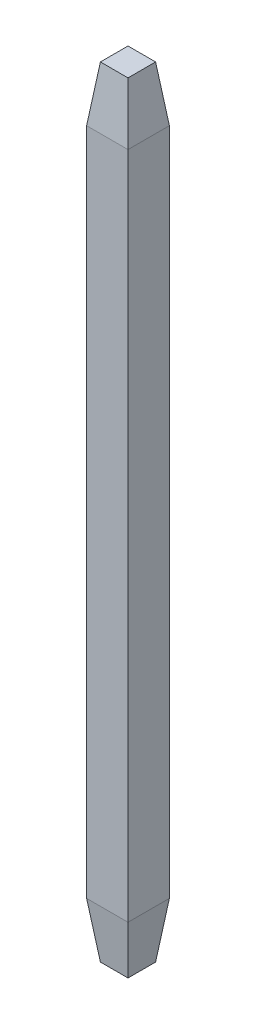
ISO-10303-21;
HEADER;
FILE_DESCRIPTION(('STEP AP214'),'2;1');
FILE_NAME('part.step','',(''),(''),'','','');
FILE_SCHEMA(('AUTOMOTIVE_DESIGN { 1 0 10303 214 1 1 1 1 }'));
ENDSEC;
DATA;
#1=APPLICATION_CONTEXT('core data for automotive mechanical design processes');
#2=APPLICATION_PROTOCOL_DEFINITION('international standard','automotive_design',2000,#1);
#3=PRODUCT_CONTEXT('',#1,'mechanical');
#4=PRODUCT('Part','Part','',(#3));
#5=PRODUCT_RELATED_PRODUCT_CATEGORY('part','',(#4));
#6=PRODUCT_DEFINITION_FORMATION('','',#4);
#7=PRODUCT_DEFINITION_CONTEXT('part definition',#1,'design');
#8=PRODUCT_DEFINITION('design','',#6,#7);
#9=PRODUCT_DEFINITION_SHAPE('','',#8);
#10=(LENGTH_UNIT() NAMED_UNIT(*) SI_UNIT(.MILLI.,.METRE.));
#11=(NAMED_UNIT(*) PLANE_ANGLE_UNIT() SI_UNIT($,.RADIAN.));
#12=(NAMED_UNIT(*) SI_UNIT($,.STERADIAN.) SOLID_ANGLE_UNIT());
#13=UNCERTAINTY_MEASURE_WITH_UNIT(LENGTH_MEASURE(1.E-05),#10,'distance_accuracy_value','');
#14=(GEOMETRIC_REPRESENTATION_CONTEXT(3) GLOBAL_UNCERTAINTY_ASSIGNED_CONTEXT((#13)) GLOBAL_UNIT_ASSIGNED_CONTEXT((#10,
#11,#12)) REPRESENTATION_CONTEXT('',''));
#15=CARTESIAN_POINT('',(0.,0.,0.));
#16=DIRECTION('',(0.,0.,1.));
#17=DIRECTION('',(1.,0.,0.));
#18=AXIS2_PLACEMENT_3D('',#15,#16,#17);
#19=CARTESIAN_POINT('',(0.3,11.3,0.3));
#20=DIRECTION('',(-1.,0.,0.));
#21=DIRECTION('',(0.,0.,1.));
#22=AXIS2_PLACEMENT_3D('',#19,#20,#21);
#23=PLANE('',#22);
#24=DIRECTION('',(0.,-1.,0.));
#25=VECTOR('',#24,1.);
#26=CARTESIAN_POINT('',(0.3,11.3,0.3));
#27=LINE('',#26,#25);
#28=CARTESIAN_POINT('',(0.3,10.5,0.3));
#29=VERTEX_POINT('',#28);
#30=CARTESIAN_POINT('',(0.3,0.8,0.3));
#31=VERTEX_POINT('',#30);
#32=EDGE_CURVE('E141',#29,#31,#27,.T.);
#33=ORIENTED_EDGE('',*,*,#32,.T.);
#34=DIRECTION('',(0.,0.,-1.));
#35=VECTOR('',#34,1.);
#36=CARTESIAN_POINT('',(0.3,0.8,-0.3));
#37=LINE('',#36,#35);
#38=CARTESIAN_POINT('',(0.3,0.8,-0.3));
#39=VERTEX_POINT('',#38);
#40=EDGE_CURVE('E150',#31,#39,#37,.T.);
#41=ORIENTED_EDGE('',*,*,#40,.T.);
#42=DIRECTION('',(0.,-1.,0.));
#43=VECTOR('',#42,1.);
#44=CARTESIAN_POINT('',(0.3,11.3,-0.3));
#45=LINE('',#44,#43);
#46=CARTESIAN_POINT('',(0.3,10.5,-0.3));
#47=VERTEX_POINT('',#46);
#48=EDGE_CURVE('E119',#47,#39,#45,.T.);
#49=ORIENTED_EDGE('',*,*,#48,.F.);
#50=DIRECTION('',(0.,0.,1.));
#51=VECTOR('',#50,1.);
#52=CARTESIAN_POINT('',(0.3,10.5,0.3));
#53=LINE('',#52,#51);
#54=EDGE_CURVE('E152',#47,#29,#53,.T.);
#55=ORIENTED_EDGE('',*,*,#54,.T.);
#56=EDGE_LOOP('',(#33,#41,#49,#55));
#57=FACE_BOUND('',#56,.T.);
#58=ADVANCED_FACE('F32',(#57),#23,.F.);
#59=CARTESIAN_POINT('',(-0.3,11.3,-0.3));
#60=DIRECTION('',(0.,0.,1.));
#61=DIRECTION('',(1.,0.,0.));
#62=AXIS2_PLACEMENT_3D('',#59,#60,#61);
#63=PLANE('',#62);
#64=ORIENTED_EDGE('',*,*,#48,.T.);
#65=DIRECTION('',(-1.,0.,0.));
#66=VECTOR('',#65,1.);
#67=CARTESIAN_POINT('',(-0.3,0.8,-0.3));
#68=LINE('',#67,#66);
#69=CARTESIAN_POINT('',(-0.3,0.8,-0.3));
#70=VERTEX_POINT('',#69);
#71=EDGE_CURVE('E118',#39,#70,#68,.T.);
#72=ORIENTED_EDGE('',*,*,#71,.T.);
#73=DIRECTION('',(0.,-1.,0.));
#74=VECTOR('',#73,1.);
#75=CARTESIAN_POINT('',(-0.3,11.3,-0.3));
#76=LINE('',#75,#74);
#77=CARTESIAN_POINT('',(-0.3,10.5,-0.3));
#78=VERTEX_POINT('',#77);
#79=EDGE_CURVE('E101',#78,#70,#76,.T.);
#80=ORIENTED_EDGE('',*,*,#79,.F.);
#81=DIRECTION('',(1.,0.,0.));
#82=VECTOR('',#81,1.);
#83=CARTESIAN_POINT('',(-0.3,10.5,-0.3));
#84=LINE('',#83,#82);
#85=EDGE_CURVE('E115',#78,#47,#84,.T.);
#86=ORIENTED_EDGE('',*,*,#85,.T.);
#87=EDGE_LOOP('',(#64,#72,#80,#86));
#88=FACE_BOUND('',#87,.T.);
#89=ADVANCED_FACE('F114',(#88),#63,.F.);
#90=CARTESIAN_POINT('',(-0.3,11.3,0.3));
#91=DIRECTION('',(1.,0.,0.));
#92=DIRECTION('',(0.,0.,-1.));
#93=AXIS2_PLACEMENT_3D('',#90,#91,#92);
#94=PLANE('',#93);
#95=ORIENTED_EDGE('',*,*,#79,.T.);
#96=DIRECTION('',(0.,0.,1.));
#97=VECTOR('',#96,1.);
#98=CARTESIAN_POINT('',(-0.3,0.8,0.3));
#99=LINE('',#98,#97);
#100=CARTESIAN_POINT('',(-0.3,0.8,0.3));
#101=VERTEX_POINT('',#100);
#102=EDGE_CURVE('E107',#70,#101,#99,.T.);
#103=ORIENTED_EDGE('',*,*,#102,.T.);
#104=DIRECTION('',(0.,-1.,0.));
#105=VECTOR('',#104,1.);
#106=CARTESIAN_POINT('',(-0.3,11.3,0.3));
#107=LINE('',#106,#105);
#108=CARTESIAN_POINT('',(-0.3,10.5,0.3));
#109=VERTEX_POINT('',#108);
#110=EDGE_CURVE('E103',#109,#101,#107,.T.);
#111=ORIENTED_EDGE('',*,*,#110,.F.);
#112=DIRECTION('',(0.,0.,-1.));
#113=VECTOR('',#112,1.);
#114=CARTESIAN_POINT('',(-0.3,10.5,0.3));
#115=LINE('',#114,#113);
#116=EDGE_CURVE('E98',#109,#78,#115,.T.);
#117=ORIENTED_EDGE('',*,*,#116,.T.);
#118=EDGE_LOOP('',(#95,#103,#111,#117));
#119=FACE_BOUND('',#118,.T.);
#120=ADVANCED_FACE('F100',(#119),#94,.F.);
#121=CARTESIAN_POINT('',(-0.3,11.3,0.3));
#122=DIRECTION('',(0.,0.,-1.));
#123=DIRECTION('',(-1.,0.,0.));
#124=AXIS2_PLACEMENT_3D('',#121,#122,#123);
#125=PLANE('',#124);
#126=ORIENTED_EDGE('',*,*,#110,.T.);
#127=DIRECTION('',(1.,0.,0.));
#128=VECTOR('',#127,1.);
#129=CARTESIAN_POINT('',(0.3,0.8,0.3));
#130=LINE('',#129,#128);
#131=EDGE_CURVE('E154',#101,#31,#130,.T.);
#132=ORIENTED_EDGE('',*,*,#131,.T.);
#133=ORIENTED_EDGE('',*,*,#32,.F.);
#134=DIRECTION('',(-1.,0.,0.));
#135=VECTOR('',#134,1.);
#136=CARTESIAN_POINT('',(-0.3,10.5,0.3));
#137=LINE('',#136,#135);
#138=EDGE_CURVE('E156',#29,#109,#137,.T.);
#139=ORIENTED_EDGE('',*,*,#138,.T.);
#140=EDGE_LOOP('',(#126,#132,#133,#139));
#141=FACE_BOUND('',#140,.T.);
#142=ADVANCED_FACE('F194',(#141),#125,.F.);
#143=CARTESIAN_POINT('',(0.,11.3,0.));
#144=DIRECTION('',(0.,-1.,0.));
#145=DIRECTION('',(0.,0.,-1.));
#146=AXIS2_PLACEMENT_3D('',#143,#144,#145);
#147=PLANE('',#146);
#148=DIRECTION('',(0.,0.,1.));
#149=VECTOR('',#148,1.);
#150=CARTESIAN_POINT('',(-0.2,11.3,0.));
#151=LINE('',#150,#149);
#152=CARTESIAN_POINT('',(-0.2,11.3,-0.2));
#153=VERTEX_POINT('',#152);
#154=CARTESIAN_POINT('',(-0.2,11.3,0.2));
#155=VERTEX_POINT('',#154);
#156=EDGE_CURVE('E41',#153,#155,#151,.T.);
#157=ORIENTED_EDGE('',*,*,#156,.T.);
#158=DIRECTION('',(1.,0.,0.));
#159=VECTOR('',#158,1.);
#160=CARTESIAN_POINT('',(0.,11.3,0.2));
#161=LINE('',#160,#159);
#162=CARTESIAN_POINT('',(0.2,11.3,0.2));
#163=VERTEX_POINT('',#162);
#164=EDGE_CURVE('E11',#155,#163,#161,.T.);
#165=ORIENTED_EDGE('',*,*,#164,.T.);
#166=DIRECTION('',(0.,0.,-1.));
#167=VECTOR('',#166,1.);
#168=CARTESIAN_POINT('',(0.2,11.3,0.));
#169=LINE('',#168,#167);
#170=CARTESIAN_POINT('',(0.2,11.3,-0.2));
#171=VERTEX_POINT('',#170);
#172=EDGE_CURVE('E148',#163,#171,#169,.T.);
#173=ORIENTED_EDGE('',*,*,#172,.T.);
#174=DIRECTION('',(-1.,0.,0.));
#175=VECTOR('',#174,1.);
#176=CARTESIAN_POINT('',(0.,11.3,-0.2));
#177=LINE('',#176,#175);
#178=EDGE_CURVE('E52',#171,#153,#177,.T.);
#179=ORIENTED_EDGE('',*,*,#178,.T.);
#180=EDGE_LOOP('',(#157,#165,#173,#179));
#181=FACE_BOUND('',#180,.T.);
#182=ADVANCED_FACE('F200',(#181),#147,.F.);
#183=CARTESIAN_POINT('',(0.,0.,0.));
#184=DIRECTION('',(0.,-1.,0.));
#185=DIRECTION('',(0.,0.,-1.));
#186=AXIS2_PLACEMENT_3D('',#183,#184,#185);
#187=PLANE('',#186);
#188=DIRECTION('',(0.,0.,-1.));
#189=VECTOR('',#188,1.);
#190=CARTESIAN_POINT('',(-0.2,0.,-0.3));
#191=LINE('',#190,#189);
#192=CARTESIAN_POINT('',(-0.2,0.,0.2));
#193=VERTEX_POINT('',#192);
#194=CARTESIAN_POINT('',(-0.2,0.,-0.2));
#195=VERTEX_POINT('',#194);
#196=EDGE_CURVE('E161',#193,#195,#191,.T.);
#197=ORIENTED_EDGE('',*,*,#196,.T.);
#198=DIRECTION('',(1.,0.,0.));
#199=VECTOR('',#198,1.);
#200=CARTESIAN_POINT('',(0.3,0.,-0.2));
#201=LINE('',#200,#199);
#202=CARTESIAN_POINT('',(0.2,0.,-0.2));
#203=VERTEX_POINT('',#202);
#204=EDGE_CURVE('E108',#195,#203,#201,.T.);
#205=ORIENTED_EDGE('',*,*,#204,.T.);
#206=DIRECTION('',(0.,0.,1.));
#207=VECTOR('',#206,1.);
#208=CARTESIAN_POINT('',(0.2,0.,0.3));
#209=LINE('',#208,#207);
#210=CARTESIAN_POINT('',(0.2,0.,0.2));
#211=VERTEX_POINT('',#210);
#212=EDGE_CURVE('E165',#203,#211,#209,.T.);
#213=ORIENTED_EDGE('',*,*,#212,.T.);
#214=DIRECTION('',(-1.,0.,0.));
#215=VECTOR('',#214,1.);
#216=CARTESIAN_POINT('',(-0.3,0.,0.2));
#217=LINE('',#216,#215);
#218=EDGE_CURVE('E163',#211,#193,#217,.T.);
#219=ORIENTED_EDGE('',*,*,#218,.T.);
#220=EDGE_LOOP('',(#197,#205,#213,#219));
#221=FACE_BOUND('',#220,.T.);
#222=ADVANCED_FACE('F202',(#221),#187,.T.);
#223=CARTESIAN_POINT('',(-0.3,0.8,0.3));
#224=DIRECTION('',(0.,-0.124034734589208,0.992277876713668));
#225=DIRECTION('',(-1.,0.,0.));
#226=AXIS2_PLACEMENT_3D('',#223,#224,#225);
#227=PLANE('',#226);
#228=DIRECTION('',(0.123091490979333,-0.984731927834662,-0.123091490979333));
#229=VECTOR('',#228,1.);
#230=CARTESIAN_POINT('',(-0.3,0.8,0.3));
#231=LINE('',#230,#229);
#232=EDGE_CURVE('E142',#193,#101,#231,.F.);
#233=ORIENTED_EDGE('',*,*,#232,.F.);
#234=ORIENTED_EDGE('',*,*,#218,.F.);
#235=DIRECTION('',(-0.123091490979333,-0.984731927834662,-0.123091490979333));
#236=VECTOR('',#235,1.);
#237=CARTESIAN_POINT('',(0.3,0.8,0.3));
#238=LINE('',#237,#236);
#239=EDGE_CURVE('E138',#31,#211,#238,.T.);
#240=ORIENTED_EDGE('',*,*,#239,.F.);
#241=ORIENTED_EDGE('',*,*,#131,.F.);
#242=EDGE_LOOP('',(#233,#234,#240,#241));
#243=FACE_BOUND('',#242,.T.);
#244=ADVANCED_FACE('F181',(#243),#227,.T.);
#245=CARTESIAN_POINT('',(0.3,0.8,0.3));
#246=DIRECTION('',(0.992277876713668,-0.124034734589208,0.));
#247=DIRECTION('',(0.,0.,1.));
#248=AXIS2_PLACEMENT_3D('',#245,#246,#247);
#249=PLANE('',#248);
#250=ORIENTED_EDGE('',*,*,#239,.T.);
#251=ORIENTED_EDGE('',*,*,#212,.F.);
#252=DIRECTION('',(0.123091490979333,0.984731927834662,-0.123091490979333));
#253=VECTOR('',#252,1.);
#254=CARTESIAN_POINT('',(0.290909090909091,0.727272727272728,-0.290909090909091));
#255=LINE('',#254,#253);
#256=EDGE_CURVE('E129',#39,#203,#255,.F.);
#257=ORIENTED_EDGE('',*,*,#256,.F.);
#258=ORIENTED_EDGE('',*,*,#40,.F.);
#259=EDGE_LOOP('',(#250,#251,#257,#258));
#260=FACE_BOUND('',#259,.T.);
#261=ADVANCED_FACE('F185',(#260),#249,.T.);
#262=CARTESIAN_POINT('',(-0.3,0.8,0.3));
#263=DIRECTION('',(-0.992277876713668,-0.124034734589208,0.));
#264=DIRECTION('',(0.,0.,-1.));
#265=AXIS2_PLACEMENT_3D('',#262,#263,#264);
#266=PLANE('',#265);
#267=ORIENTED_EDGE('',*,*,#232,.T.);
#268=ORIENTED_EDGE('',*,*,#102,.F.);
#269=DIRECTION('',(0.123091490979333,-0.984731927834662,0.123091490979333));
#270=VECTOR('',#269,1.);
#271=CARTESIAN_POINT('',(-0.290909090909091,0.727272727272728,-0.290909090909091));
#272=LINE('',#271,#270);
#273=EDGE_CURVE('E128',#195,#70,#272,.F.);
#274=ORIENTED_EDGE('',*,*,#273,.F.);
#275=ORIENTED_EDGE('',*,*,#196,.F.);
#276=EDGE_LOOP('',(#267,#268,#274,#275));
#277=FACE_BOUND('',#276,.T.);
#278=ADVANCED_FACE('F193',(#277),#266,.T.);
#279=CARTESIAN_POINT('',(-0.3,0.8,-0.3));
#280=DIRECTION('',(0.,-0.124034734589208,-0.992277876713668));
#281=DIRECTION('',(1.,0.,0.));
#282=AXIS2_PLACEMENT_3D('',#279,#280,#281);
#283=PLANE('',#282);
#284=ORIENTED_EDGE('',*,*,#256,.T.);
#285=ORIENTED_EDGE('',*,*,#204,.F.);
#286=ORIENTED_EDGE('',*,*,#273,.T.);
#287=ORIENTED_EDGE('',*,*,#71,.F.);
#288=EDGE_LOOP('',(#284,#285,#286,#287));
#289=FACE_BOUND('',#288,.T.);
#290=ADVANCED_FACE('F188',(#289),#283,.T.);
#291=CARTESIAN_POINT('',(0.,11.3,-0.2));
#292=DIRECTION('',(0.,-0.124034734589205,0.992277876713668));
#293=DIRECTION('',(-1.,0.,0.));
#294=AXIS2_PLACEMENT_3D('',#291,#292,#293);
#295=PLANE('',#294);
#296=DIRECTION('',(-0.123091490979329,0.984731927834663,0.123091490979329));
#297=VECTOR('',#296,1.);
#298=CARTESIAN_POINT('',(0.196969696969697,11.3242424242424,-0.196969696969697));
#299=LINE('',#298,#297);
#300=EDGE_CURVE('E124',#47,#171,#299,.T.);
#301=ORIENTED_EDGE('',*,*,#300,.F.);
#302=ORIENTED_EDGE('',*,*,#85,.F.);
#303=DIRECTION('',(0.123091490979329,0.984731927834663,0.123091490979329));
#304=VECTOR('',#303,1.);
#305=CARTESIAN_POINT('',(-0.196969696969697,11.3242424242424,-0.196969696969697));
#306=LINE('',#305,#304);
#307=EDGE_CURVE('E36',#153,#78,#306,.F.);
#308=ORIENTED_EDGE('',*,*,#307,.F.);
#309=ORIENTED_EDGE('',*,*,#178,.F.);
#310=EDGE_LOOP('',(#301,#302,#308,#309));
#311=FACE_BOUND('',#310,.T.);
#312=ADVANCED_FACE('F34',(#311),#295,.F.);
#313=CARTESIAN_POINT('',(-0.2,11.3,0.));
#314=DIRECTION('',(0.992277876713668,-0.124034734589205,0.));
#315=DIRECTION('',(0.,0.,1.));
#316=AXIS2_PLACEMENT_3D('',#313,#314,#315);
#317=PLANE('',#316);
#318=ORIENTED_EDGE('',*,*,#307,.T.);
#319=ORIENTED_EDGE('',*,*,#116,.F.);
#320=DIRECTION('',(0.123091490979329,0.984731927834663,-0.123091490979329));
#321=VECTOR('',#320,1.);
#322=CARTESIAN_POINT('',(-0.196969696969697,11.3242424242424,0.196969696969697));
#323=LINE('',#322,#321);
#324=EDGE_CURVE('E131',#155,#109,#323,.F.);
#325=ORIENTED_EDGE('',*,*,#324,.F.);
#326=ORIENTED_EDGE('',*,*,#156,.F.);
#327=EDGE_LOOP('',(#318,#319,#325,#326));
#328=FACE_BOUND('',#327,.T.);
#329=ADVANCED_FACE('F127',(#328),#317,.F.);
#330=CARTESIAN_POINT('',(0.2,11.3,0.));
#331=DIRECTION('',(-0.992277876713668,-0.124034734589205,0.));
#332=DIRECTION('',(0.,0.,-1.));
#333=AXIS2_PLACEMENT_3D('',#330,#331,#332);
#334=PLANE('',#333);
#335=ORIENTED_EDGE('',*,*,#300,.T.);
#336=ORIENTED_EDGE('',*,*,#172,.F.);
#337=DIRECTION('',(0.123091490979329,-0.984731927834663,0.123091490979329));
#338=VECTOR('',#337,1.);
#339=CARTESIAN_POINT('',(0.196969696969697,11.3242424242424,0.196969696969697));
#340=LINE('',#339,#338);
#341=EDGE_CURVE('E134',#29,#163,#340,.F.);
#342=ORIENTED_EDGE('',*,*,#341,.F.);
#343=ORIENTED_EDGE('',*,*,#54,.F.);
#344=EDGE_LOOP('',(#335,#336,#342,#343));
#345=FACE_BOUND('',#344,.T.);
#346=ADVANCED_FACE('F199',(#345),#334,.F.);
#347=CARTESIAN_POINT('',(0.,11.3,0.2));
#348=DIRECTION('',(0.,-0.124034734589205,-0.992277876713668));
#349=DIRECTION('',(1.,0.,0.));
#350=AXIS2_PLACEMENT_3D('',#347,#348,#349);
#351=PLANE('',#350);
#352=ORIENTED_EDGE('',*,*,#324,.T.);
#353=ORIENTED_EDGE('',*,*,#138,.F.);
#354=ORIENTED_EDGE('',*,*,#341,.T.);
#355=ORIENTED_EDGE('',*,*,#164,.F.);
#356=EDGE_LOOP('',(#352,#353,#354,#355));
#357=FACE_BOUND('',#356,.T.);
#358=ADVANCED_FACE('F197',(#357),#351,.F.);
#359=CLOSED_SHELL('',(#58,#89,#120,#142,#182,#222,#244,#261,#278,#290,#312,#329,#346,#358));
#360=MANIFOLD_SOLID_BREP('B2',#359);
#361=ADVANCED_BREP_SHAPE_REPRESENTATION('',(#18,#360),#14);
#362=SHAPE_DEFINITION_REPRESENTATION(#9,#361);
ENDSEC;
END-ISO-10303-21;
